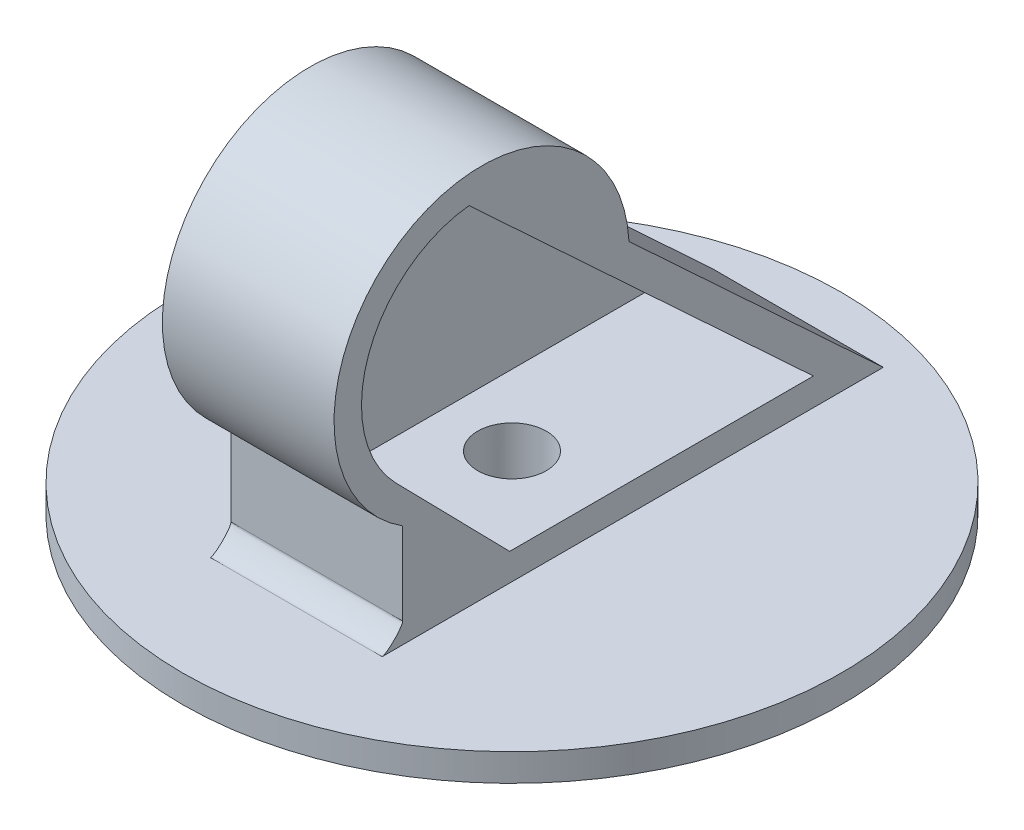
ISO-10303-21;
HEADER;
FILE_DESCRIPTION(('STEP AP214'),'2;1');
FILE_NAME('part.step','',(''),(''),'','','');
FILE_SCHEMA(('AUTOMOTIVE_DESIGN { 1 0 10303 214 1 1 1 1 }'));
ENDSEC;
DATA;
#1=APPLICATION_CONTEXT('core data for automotive mechanical design processes');
#2=APPLICATION_PROTOCOL_DEFINITION('international standard','automotive_design',2000,#1);
#3=PRODUCT_CONTEXT('',#1,'mechanical');
#4=PRODUCT('Part','Part','',(#3));
#5=PRODUCT_RELATED_PRODUCT_CATEGORY('part','',(#4));
#6=PRODUCT_DEFINITION_FORMATION('','',#4);
#7=PRODUCT_DEFINITION_CONTEXT('part definition',#1,'design');
#8=PRODUCT_DEFINITION('design','',#6,#7);
#9=PRODUCT_DEFINITION_SHAPE('','',#8);
#10=(LENGTH_UNIT() NAMED_UNIT(*) SI_UNIT(.MILLI.,.METRE.));
#11=(NAMED_UNIT(*) PLANE_ANGLE_UNIT() SI_UNIT($,.RADIAN.));
#12=(NAMED_UNIT(*) SI_UNIT($,.STERADIAN.) SOLID_ANGLE_UNIT());
#13=UNCERTAINTY_MEASURE_WITH_UNIT(LENGTH_MEASURE(1.E-05),#10,'distance_accuracy_value','');
#14=(GEOMETRIC_REPRESENTATION_CONTEXT(3) GLOBAL_UNCERTAINTY_ASSIGNED_CONTEXT((#13)) GLOBAL_UNIT_ASSIGNED_CONTEXT((#10,
#11,#12)) REPRESENTATION_CONTEXT('',''));
#15=CARTESIAN_POINT('',(0.,0.,0.));
#16=DIRECTION('',(0.,0.,1.));
#17=DIRECTION('',(1.,0.,0.));
#18=AXIS2_PLACEMENT_3D('',#15,#16,#17);
#19=CARTESIAN_POINT('',(43.5478533605228,4.,-109.406353042929));
#20=CARTESIAN_POINT('',(14.5159511201743,4.,-109.406353042929));
#21=CARTESIAN_POINT('',(-14.5159511201743,4.,-109.406353042929));
#22=CARTESIAN_POINT('',(-43.5478533605228,4.,-109.406353042929));
#23=CARTESIAN_POINT('',(43.5478533605228,4.,-112.406353042929));
#24=CARTESIAN_POINT('',(14.5159511201743,4.,-112.406353042929));
#25=CARTESIAN_POINT('',(-14.5159511201743,4.,-112.406353042929));
#26=CARTESIAN_POINT('',(-43.5478533605228,4.,-112.406353042929));
#27=CARTESIAN_POINT('',(43.5478533605228,7.,-112.406353042929));
#28=CARTESIAN_POINT('',(14.5159511201743,7.,-112.406353042929));
#29=CARTESIAN_POINT('',(-14.5159511201743,7.,-112.406353042929));
#30=CARTESIAN_POINT('',(-43.5478533605228,7.,-112.406353042929));
#31=(BOUNDED_SURFACE() B_SPLINE_SURFACE(2,3,((#19,#20,#21,#22),(#23,#24,#25,#26),(#27,#28,#29,
#30)),.UNSPECIFIED.,.F.,.F.,.F.) B_SPLINE_SURFACE_WITH_KNOTS((3,3),(4,4),(0.,1.),
(-0.0310478533605228,0.0560478533605228),
.UNSPECIFIED.) GEOMETRIC_REPRESENTATION_ITEM() RATIONAL_B_SPLINE_SURFACE(((1.,1.,1.,1.),
(0.212132034355964,0.212132034355964,0.212132034355964,0.212132034355964),(1.,1.,1.,1.))) REPRESENTATION_ITEM('') SURFACE());
#32=CARTESIAN_POINT('',(43.5478533605228,7.,-112.406353042929));
#33=CARTESIAN_POINT('',(14.5159511201743,7.,-112.406353042929));
#34=CARTESIAN_POINT('',(-14.5159511201743,7.,-112.406353042929));
#35=CARTESIAN_POINT('',(-43.5478533605228,7.,-112.406353042929));
#36=(BOUNDED_CURVE() B_SPLINE_CURVE(3,(#32,#33,#34,#35),.UNSPECIFIED.,.F.,
.F.) B_SPLINE_CURVE_WITH_KNOTS((4,4),(-0.0310478533605228,0.0560478533605228),
.UNSPECIFIED.) CURVE() GEOMETRIC_REPRESENTATION_ITEM() RATIONAL_B_SPLINE_CURVE((1.,1.,1.,1.)) REPRESENTATION_ITEM(''));
#37=CARTESIAN_POINT('',(-12.5,7.,-112.406353042929));
#38=VERTEX_POINT('',#37);
#39=CARTESIAN_POINT('',(12.5,7.,-112.406353042929));
#40=VERTEX_POINT('',#39);
#41=EDGE_CURVE('E214',#38,#40,#36,.F.);
#42=CARTESIAN_POINT('',(-12.5,7.,-112.406353042929));
#43=CARTESIAN_POINT('',(-12.5,4.,-112.406353042929));
#44=CARTESIAN_POINT('',(-12.5,4.,-109.406353042929));
#45=(BOUNDED_CURVE() B_SPLINE_CURVE(2,(#42,#43,#44),.UNSPECIFIED.,.F.,
.F.) B_SPLINE_CURVE_WITH_KNOTS((3,3),(0.,1.),
.UNSPECIFIED.) CURVE() GEOMETRIC_REPRESENTATION_ITEM() RATIONAL_B_SPLINE_CURVE((1.,
0.212132034355964,1.)) REPRESENTATION_ITEM(''));
#46=CARTESIAN_POINT('',(-12.5,4.,-109.406353042929));
#47=VERTEX_POINT('',#46);
#48=EDGE_CURVE('E75',#38,#47,#45,.T.);
#49=CARTESIAN_POINT('',(-43.5478533605228,4.,-109.406353042929));
#50=CARTESIAN_POINT('',(-14.5159511201743,4.,-109.406353042929));
#51=CARTESIAN_POINT('',(14.5159511201743,4.,-109.406353042929));
#52=CARTESIAN_POINT('',(43.5478533605228,4.,-109.406353042929));
#53=(BOUNDED_CURVE() B_SPLINE_CURVE(3,(#49,#50,#51,#52),.UNSPECIFIED.,.F.,
.F.) B_SPLINE_CURVE_WITH_KNOTS((4,4),(-0.0310478533605228,0.0560478533605228),
.UNSPECIFIED.) CURVE() GEOMETRIC_REPRESENTATION_ITEM() RATIONAL_B_SPLINE_CURVE((1.,1.,1.,1.)) REPRESENTATION_ITEM(''));
#54=CARTESIAN_POINT('',(12.5,4.,-109.406353042929));
#55=VERTEX_POINT('',#54);
#56=EDGE_CURVE('E327',#55,#47,#53,.F.);
#57=CARTESIAN_POINT('',(12.5,4.,-109.406353042929));
#58=CARTESIAN_POINT('',(12.5,4.,-112.406353042929));
#59=CARTESIAN_POINT('',(12.5,7.,-112.406353042929));
#60=(BOUNDED_CURVE() B_SPLINE_CURVE(2,(#57,#58,#59),.UNSPECIFIED.,.F.,
.F.) B_SPLINE_CURVE_WITH_KNOTS((3,3),(0.,1.),
.UNSPECIFIED.) CURVE() GEOMETRIC_REPRESENTATION_ITEM() RATIONAL_B_SPLINE_CURVE((1.,
0.212132034355964,1.)) REPRESENTATION_ITEM(''));
#61=EDGE_CURVE('E13',#55,#40,#60,.T.);
#62=ORIENTED_EDGE('',*,*,#41,.F.);
#63=ORIENTED_EDGE('',*,*,#48,.T.);
#64=ORIENTED_EDGE('',*,*,#56,.F.);
#65=ORIENTED_EDGE('',*,*,#61,.T.);
#66=EDGE_LOOP('',(#62,#63,#64,#65));
#67=FACE_BOUND('',#66,.T.);
#68=ADVANCED_FACE('F62',(#67),#31,.T.);
#69=CARTESIAN_POINT('',(0.,0.,-99.5736216897968));
#70=DIRECTION('',(0.,-1.,0.));
#71=DIRECTION('',(0.,0.,-1.));
#72=AXIS2_PLACEMENT_3D('',#69,#70,#71);
#73=DEGENERATE_TOROIDAL_SURFACE('',#72,0.650000000000002,1.1,.T.);
#74=CARTESIAN_POINT('',(0.,1.1,-99.5736216897968));
#75=DIRECTION('',(0.,-1.,0.));
#76=DIRECTION('',(0.,0.,-1.));
#77=AXIS2_PLACEMENT_3D('',#74,#75,#76);
#78=CIRCLE('',#77,0.650000000000002);
#79=CARTESIAN_POINT('',(0.,1.1,-100.223621689797));
#80=VERTEX_POINT('',#79);
#81=EDGE_CURVE('E466',#80,#80,#78,.T.);
#82=ORIENTED_EDGE('',*,*,#81,.F.);
#83=EDGE_LOOP('',(#82));
#84=FACE_BOUND('',#83,.T.);
#85=CARTESIAN_POINT('',(0.,0.,-99.5736216897968));
#86=DIRECTION('',(0.,-1.,0.));
#87=DIRECTION('',(0.,0.,-1.));
#88=AXIS2_PLACEMENT_3D('',#85,#86,#87);
#89=CIRCLE('',#88,1.75);
#90=CARTESIAN_POINT('',(0.,0.,-101.323621689797));
#91=VERTEX_POINT('',#90);
#92=EDGE_CURVE('E457',#91,#91,#89,.T.);
#93=ORIENTED_EDGE('',*,*,#92,.T.);
#94=EDGE_LOOP('',(#93));
#95=FACE_BOUND('',#94,.T.);
#96=ADVANCED_FACE('F480',(#84,#95),#73,.F.);
#97=CARTESIAN_POINT('',(0.,4.,-140.823621689797));
#98=DIRECTION('',(0.,-1.,0.));
#99=DIRECTION('',(0.,0.,-1.));
#100=AXIS2_PLACEMENT_3D('',#97,#98,#99);
#101=CYLINDRICAL_SURFACE('',#100,48.);
#102=CARTESIAN_POINT('',(0.,4.,-140.823621689797));
#103=DIRECTION('',(0.,1.,0.));
#104=DIRECTION('',(0.,0.,1.));
#105=AXIS2_PLACEMENT_3D('',#102,#103,#104);
#106=CIRCLE('',#105,48.);
#107=CARTESIAN_POINT('',(0.,4.,-92.8236216897968));
#108=VERTEX_POINT('',#107);
#109=EDGE_CURVE('E462',#108,#108,#106,.T.);
#110=ORIENTED_EDGE('',*,*,#109,.F.);
#111=EDGE_LOOP('',(#110));
#112=FACE_BOUND('',#111,.T.);
#113=CARTESIAN_POINT('',(0.,0.,-140.823621689797));
#114=DIRECTION('',(0.,1.,0.));
#115=DIRECTION('',(0.,0.,1.));
#116=AXIS2_PLACEMENT_3D('',#113,#114,#115);
#117=CIRCLE('',#116,48.);
#118=CARTESIAN_POINT('',(0.,0.,-92.8236216897968));
#119=VERTEX_POINT('',#118);
#120=EDGE_CURVE('E461',#119,#119,#117,.T.);
#121=ORIENTED_EDGE('',*,*,#120,.T.);
#122=EDGE_LOOP('',(#121));
#123=FACE_BOUND('',#122,.T.);
#124=ADVANCED_FACE('F304',(#112,#123),#101,.T.);
#125=CARTESIAN_POINT('',(0.,4.,-140.823621689797));
#126=DIRECTION('',(0.,1.,0.));
#127=DIRECTION('',(0.,0.,1.));
#128=AXIS2_PLACEMENT_3D('',#125,#126,#127);
#129=PLANE('',#128);
#130=ORIENTED_EDGE('',*,*,#56,.T.);
#131=DIRECTION('',(0.,0.,1.));
#132=VECTOR('',#131,1.);
#133=CARTESIAN_POINT('',(-12.5,3.99999999999999,0.));
#134=LINE('',#133,#132);
#135=CARTESIAN_POINT('',(-12.5,4.,-182.406353042929));
#136=VERTEX_POINT('',#135);
#137=EDGE_CURVE('E90',#136,#47,#134,.T.);
#138=ORIENTED_EDGE('',*,*,#137,.F.);
#139=DIRECTION('',(-1.,0.,0.));
#140=VECTOR('',#139,1.);
#141=CARTESIAN_POINT('',(12.5,4.,-182.406353042929));
#142=LINE('',#141,#140);
#143=CARTESIAN_POINT('',(12.5,4.,-182.406353042929));
#144=VERTEX_POINT('',#143);
#145=EDGE_CURVE('E385',#144,#136,#142,.T.);
#146=ORIENTED_EDGE('',*,*,#145,.F.);
#147=DIRECTION('',(0.,0.,1.));
#148=VECTOR('',#147,1.);
#149=CARTESIAN_POINT('',(12.5,3.99999999999999,0.));
#150=LINE('',#149,#148);
#151=EDGE_CURVE('E205',#144,#55,#150,.T.);
#152=ORIENTED_EDGE('',*,*,#151,.T.);
#153=EDGE_LOOP('',(#130,#138,#146,#152));
#154=FACE_BOUND('',#153,.T.);
#155=ORIENTED_EDGE('',*,*,#109,.T.);
#156=EDGE_LOOP('',(#155));
#157=FACE_BOUND('',#156,.T.);
#158=ADVANCED_FACE('F300',(#154,#157),#129,.T.);
#159=CARTESIAN_POINT('',(0.,0.,-140.823621689797));
#160=DIRECTION('',(0.,1.,0.));
#161=DIRECTION('',(0.,0.,1.));
#162=AXIS2_PLACEMENT_3D('',#159,#160,#161);
#163=PLANE('',#162);
#164=CARTESIAN_POINT('',(0.,0.,-140.823621689797));
#165=DIRECTION('',(0.,1.,0.));
#166=DIRECTION('',(0.,0.,1.));
#167=AXIS2_PLACEMENT_3D('',#164,#165,#166);
#168=CIRCLE('',#167,5.);
#169=CARTESIAN_POINT('',(0.,0.,-135.823621689797));
#170=VERTEX_POINT('',#169);
#171=EDGE_CURVE('E168',#170,#170,#168,.T.);
#172=ORIENTED_EDGE('',*,*,#171,.T.);
#173=EDGE_LOOP('',(#172));
#174=FACE_BOUND('',#173,.T.);
#175=CARTESIAN_POINT('',(41.25,0.,-140.823621689797));
#176=DIRECTION('',(0.,-1.,0.));
#177=DIRECTION('',(-1.,0.,0.));
#178=AXIS2_PLACEMENT_3D('',#175,#176,#177);
#179=CIRCLE('',#178,1.75);
#180=CARTESIAN_POINT('',(39.5,0.,-140.823621689797));
#181=VERTEX_POINT('',#180);
#182=EDGE_CURVE('E418',#181,#181,#179,.T.);
#183=ORIENTED_EDGE('',*,*,#182,.F.);
#184=EDGE_LOOP('',(#183));
#185=FACE_BOUND('',#184,.T.);
#186=CARTESIAN_POINT('',(29.1681547239449,0.,-169.991776413742));
#187=DIRECTION('',(0.,-1.,0.));
#188=DIRECTION('',(-0.707106781186544,0.,0.707106781186551));
#189=AXIS2_PLACEMENT_3D('',#186,#187,#188);
#190=CIRCLE('',#189,1.75);
#191=CARTESIAN_POINT('',(27.9307178568685,0.,-168.754339546666));
#192=VERTEX_POINT('',#191);
#193=EDGE_CURVE('E428',#192,#192,#190,.T.);
#194=ORIENTED_EDGE('',*,*,#193,.F.);
#195=EDGE_LOOP('',(#194));
#196=FACE_BOUND('',#195,.T.);
#197=CARTESIAN_POINT('',(0.,0.,-182.073621689797));
#198=DIRECTION('',(0.,-1.,0.));
#199=DIRECTION('',(0.,0.,1.));
#200=AXIS2_PLACEMENT_3D('',#197,#198,#199);
#201=CIRCLE('',#200,1.75);
#202=CARTESIAN_POINT('',(0.,0.,-180.323621689797));
#203=VERTEX_POINT('',#202);
#204=EDGE_CURVE('E436',#203,#203,#201,.T.);
#205=ORIENTED_EDGE('',*,*,#204,.F.);
#206=EDGE_LOOP('',(#205));
#207=FACE_BOUND('',#206,.T.);
#208=CARTESIAN_POINT('',(-29.1681547239453,0.,-169.991776413742));
#209=DIRECTION('',(0.,-1.,0.));
#210=DIRECTION('',(0.707106781186554,0.,0.707106781186541));
#211=AXIS2_PLACEMENT_3D('',#208,#209,#210);
#212=CIRCLE('',#211,1.75);
#213=CARTESIAN_POINT('',(-27.9307178568689,0.,-168.754339546665));
#214=VERTEX_POINT('',#213);
#215=EDGE_CURVE('E411',#214,#214,#212,.T.);
#216=ORIENTED_EDGE('',*,*,#215,.F.);
#217=EDGE_LOOP('',(#216));
#218=FACE_BOUND('',#217,.T.);
#219=CARTESIAN_POINT('',(-41.25,0.,-140.823621689796));
#220=DIRECTION('',(0.,-1.,0.));
#221=DIRECTION('',(1.,0.,0.));
#222=AXIS2_PLACEMENT_3D('',#219,#220,#221);
#223=CIRCLE('',#222,1.75);
#224=CARTESIAN_POINT('',(-39.5,0.,-140.823621689796));
#225=VERTEX_POINT('',#224);
#226=EDGE_CURVE('E402',#225,#225,#223,.T.);
#227=ORIENTED_EDGE('',*,*,#226,.F.);
#228=EDGE_LOOP('',(#227));
#229=FACE_BOUND('',#228,.T.);
#230=CARTESIAN_POINT('',(-29.1681547239447,0.,-111.655466965851));
#231=DIRECTION('',(0.,-1.,0.));
#232=DIRECTION('',(0.707106781186539,0.,-0.707106781186556));
#233=AXIS2_PLACEMENT_3D('',#230,#231,#232);
#234=CIRCLE('',#233,1.75);
#235=CARTESIAN_POINT('',(-27.9307178568683,0.,-112.892903832928));
#236=VERTEX_POINT('',#235);
#237=EDGE_CURVE('E401',#236,#236,#234,.T.);
#238=ORIENTED_EDGE('',*,*,#237,.F.);
#239=EDGE_LOOP('',(#238));
#240=FACE_BOUND('',#239,.T.);
#241=CARTESIAN_POINT('',(29.1681547239451,0.,-111.655466965852));
#242=DIRECTION('',(0.,-1.,0.));
#243=DIRECTION('',(-0.707106781186549,0.,-0.707106781186546));
#244=AXIS2_PLACEMENT_3D('',#241,#242,#243);
#245=CIRCLE('',#244,1.75);
#246=CARTESIAN_POINT('',(27.9307178568687,0.,-112.892903832928));
#247=VERTEX_POINT('',#246);
#248=EDGE_CURVE('E427',#247,#247,#245,.T.);
#249=ORIENTED_EDGE('',*,*,#248,.F.);
#250=EDGE_LOOP('',(#249));
#251=FACE_BOUND('',#250,.T.);
#252=ORIENTED_EDGE('',*,*,#92,.F.);
#253=EDGE_LOOP('',(#252));
#254=FACE_BOUND('',#253,.T.);
#255=ORIENTED_EDGE('',*,*,#120,.F.);
#256=EDGE_LOOP('',(#255));
#257=FACE_BOUND('',#256,.T.);
#258=ADVANCED_FACE('F298',(#174,#185,#196,#207,#218,#229,#240,#251,#254,#257),#163,.F.);
#259=CARTESIAN_POINT('',(0.,1.1,0.));
#260=DIRECTION('',(0.,-1.,0.));
#261=DIRECTION('',(0.,0.,-1.));
#262=AXIS2_PLACEMENT_3D('',#259,#260,#261);
#263=PLANE('',#262);
#264=ORIENTED_EDGE('',*,*,#81,.T.);
#265=EDGE_LOOP('',(#264));
#266=FACE_BOUND('',#265,.T.);
#267=ADVANCED_FACE('F294',(#266),#263,.T.);
#268=CARTESIAN_POINT('',(99.5773378481045,1.1,-41.2462838416927));
#269=DIRECTION('',(0.,-1.,0.));
#270=DIRECTION('',(-0.707106781186549,0.,-0.707106781186546));
#271=AXIS2_PLACEMENT_3D('',#268,#269,#270);
#272=PLANE('',#271);
#273=CARTESIAN_POINT('',(29.1681547239451,1.1,-111.655466965852));
#274=DIRECTION('',(0.,-1.,0.));
#275=DIRECTION('',(-0.707106781186549,0.,-0.707106781186546));
#276=AXIS2_PLACEMENT_3D('',#273,#274,#275);
#277=CIRCLE('',#276,0.650000000000002);
#278=CARTESIAN_POINT('',(28.7085353161739,1.1,-112.115086373623));
#279=VERTEX_POINT('',#278);
#280=EDGE_CURVE('E453',#279,#279,#277,.T.);
#281=ORIENTED_EDGE('',*,*,#280,.T.);
#282=EDGE_LOOP('',(#281));
#283=FACE_BOUND('',#282,.T.);
#284=ADVANCED_FACE('F290',(#283),#272,.T.);
#285=CARTESIAN_POINT('',(29.1681547239451,0.,-111.655466965852));
#286=DIRECTION('',(0.,-1.,0.));
#287=DIRECTION('',(-0.707106781186549,0.,-0.707106781186546));
#288=AXIS2_PLACEMENT_3D('',#285,#286,#287);
#289=DEGENERATE_TOROIDAL_SURFACE('',#288,0.650000000000002,1.1,.T.);
#290=ORIENTED_EDGE('',*,*,#280,.F.);
#291=EDGE_LOOP('',(#290));
#292=FACE_BOUND('',#291,.T.);
#293=ORIENTED_EDGE('',*,*,#248,.T.);
#294=EDGE_LOOP('',(#293));
#295=FACE_BOUND('',#294,.T.);
#296=ADVANCED_FACE('F256',(#292,#295),#289,.F.);
#297=CARTESIAN_POINT('',(-99.5773378481031,1.1,-41.2462838416913));
#298=DIRECTION('',(0.,-1.,0.));
#299=DIRECTION('',(0.707106781186539,0.,-0.707106781186556));
#300=AXIS2_PLACEMENT_3D('',#297,#298,#299);
#301=PLANE('',#300);
#302=CARTESIAN_POINT('',(-29.1681547239447,1.1,-111.655466965851));
#303=DIRECTION('',(0.,-1.,0.));
#304=DIRECTION('',(0.707106781186539,0.,-0.707106781186556));
#305=AXIS2_PLACEMENT_3D('',#302,#303,#304);
#306=CIRCLE('',#305,0.650000000000002);
#307=CARTESIAN_POINT('',(-28.7085353161735,1.1,-112.115086373623));
#308=VERTEX_POINT('',#307);
#309=EDGE_CURVE('E407',#308,#308,#306,.T.);
#310=ORIENTED_EDGE('',*,*,#309,.T.);
#311=EDGE_LOOP('',(#310));
#312=FACE_BOUND('',#311,.T.);
#313=ADVANCED_FACE('F252',(#312),#301,.T.);
#314=CARTESIAN_POINT('',(-29.1681547239447,0.,-111.655466965851));
#315=DIRECTION('',(0.,-1.,0.));
#316=DIRECTION('',(0.707106781186539,0.,-0.707106781186556));
#317=AXIS2_PLACEMENT_3D('',#314,#315,#316);
#318=DEGENERATE_TOROIDAL_SURFACE('',#317,0.650000000000002,1.1,.T.);
#319=ORIENTED_EDGE('',*,*,#309,.F.);
#320=EDGE_LOOP('',(#319));
#321=FACE_BOUND('',#320,.T.);
#322=ORIENTED_EDGE('',*,*,#237,.T.);
#323=EDGE_LOOP('',(#322));
#324=FACE_BOUND('',#323,.T.);
#325=ADVANCED_FACE('F248',(#321,#324),#318,.F.);
#326=CARTESIAN_POINT('',(-140.823621689797,1.1,-140.823621689795));
#327=DIRECTION('',(0.,-1.,0.));
#328=DIRECTION('',(1.,0.,0.));
#329=AXIS2_PLACEMENT_3D('',#326,#327,#328);
#330=PLANE('',#329);
#331=CARTESIAN_POINT('',(-41.25,1.1,-140.823621689796));
#332=DIRECTION('',(0.,-1.,0.));
#333=DIRECTION('',(1.,0.,0.));
#334=AXIS2_PLACEMENT_3D('',#331,#332,#333);
#335=CIRCLE('',#334,0.650000000000002);
#336=CARTESIAN_POINT('',(-40.6,1.1,-140.823621689796));
#337=VERTEX_POINT('',#336);
#338=EDGE_CURVE('E406',#337,#337,#335,.T.);
#339=ORIENTED_EDGE('',*,*,#338,.T.);
#340=EDGE_LOOP('',(#339));
#341=FACE_BOUND('',#340,.T.);
#342=ADVANCED_FACE('F244',(#341),#330,.T.);
#343=CARTESIAN_POINT('',(-41.25,0.,-140.823621689796));
#344=DIRECTION('',(0.,-1.,0.));
#345=DIRECTION('',(1.,0.,0.));
#346=AXIS2_PLACEMENT_3D('',#343,#344,#345);
#347=DEGENERATE_TOROIDAL_SURFACE('',#346,0.650000000000002,1.1,.T.);
#348=ORIENTED_EDGE('',*,*,#338,.F.);
#349=EDGE_LOOP('',(#348));
#350=FACE_BOUND('',#349,.T.);
#351=ORIENTED_EDGE('',*,*,#226,.T.);
#352=EDGE_LOOP('',(#351));
#353=FACE_BOUND('',#352,.T.);
#354=ADVANCED_FACE('F240',(#350,#353),#347,.F.);
#355=CARTESIAN_POINT('',(-99.5773378481051,1.1,-240.4009595379));
#356=DIRECTION('',(0.,-1.,0.));
#357=DIRECTION('',(0.707106781186554,0.,0.707106781186541));
#358=AXIS2_PLACEMENT_3D('',#355,#356,#357);
#359=PLANE('',#358);
#360=CARTESIAN_POINT('',(-29.1681547239453,1.1,-169.991776413742));
#361=DIRECTION('',(0.,-1.,0.));
#362=DIRECTION('',(0.707106781186554,0.,0.707106781186541));
#363=AXIS2_PLACEMENT_3D('',#360,#361,#362);
#364=CIRCLE('',#363,0.650000000000002);
#365=CARTESIAN_POINT('',(-28.7085353161741,1.1,-169.53215700597));
#366=VERTEX_POINT('',#365);
#367=EDGE_CURVE('E440',#366,#366,#364,.T.);
#368=ORIENTED_EDGE('',*,*,#367,.T.);
#369=EDGE_LOOP('',(#368));
#370=FACE_BOUND('',#369,.T.);
#371=ADVANCED_FACE('F243',(#370),#359,.T.);
#372=CARTESIAN_POINT('',(-29.1681547239453,0.,-169.991776413742));
#373=DIRECTION('',(0.,-1.,0.));
#374=DIRECTION('',(0.707106781186554,0.,0.707106781186541));
#375=AXIS2_PLACEMENT_3D('',#372,#373,#374);
#376=DEGENERATE_TOROIDAL_SURFACE('',#375,0.650000000000002,1.1,.T.);
#377=ORIENTED_EDGE('',*,*,#367,.F.);
#378=EDGE_LOOP('',(#377));
#379=FACE_BOUND('',#378,.T.);
#380=ORIENTED_EDGE('',*,*,#215,.T.);
#381=EDGE_LOOP('',(#380));
#382=FACE_BOUND('',#381,.T.);
#383=ADVANCED_FACE('F280',(#379,#382),#376,.F.);
#384=CARTESIAN_POINT('',(0.,1.1,-281.647243379594));
#385=DIRECTION('',(0.,-1.,0.));
#386=DIRECTION('',(0.,0.,1.));
#387=AXIS2_PLACEMENT_3D('',#384,#385,#386);
#388=PLANE('',#387);
#389=CARTESIAN_POINT('',(0.,1.1,-182.073621689797));
#390=DIRECTION('',(0.,-1.,0.));
#391=DIRECTION('',(0.,0.,1.));
#392=AXIS2_PLACEMENT_3D('',#389,#390,#391);
#393=CIRCLE('',#392,0.650000000000002);
#394=CARTESIAN_POINT('',(0.,1.1,-181.423621689797));
#395=VERTEX_POINT('',#394);
#396=EDGE_CURVE('E432',#395,#395,#393,.T.);
#397=ORIENTED_EDGE('',*,*,#396,.T.);
#398=EDGE_LOOP('',(#397));
#399=FACE_BOUND('',#398,.T.);
#400=ADVANCED_FACE('F276',(#399),#388,.T.);
#401=CARTESIAN_POINT('',(0.,0.,-182.073621689797));
#402=DIRECTION('',(0.,-1.,0.));
#403=DIRECTION('',(0.,0.,1.));
#404=AXIS2_PLACEMENT_3D('',#401,#402,#403);
#405=DEGENERATE_TOROIDAL_SURFACE('',#404,0.650000000000002,1.1,.T.);
#406=ORIENTED_EDGE('',*,*,#396,.F.);
#407=EDGE_LOOP('',(#406));
#408=FACE_BOUND('',#407,.T.);
#409=ORIENTED_EDGE('',*,*,#204,.T.);
#410=EDGE_LOOP('',(#409));
#411=FACE_BOUND('',#410,.T.);
#412=ADVANCED_FACE('F272',(#408,#411),#405,.F.);
#413=CARTESIAN_POINT('',(99.5773378481038,1.1,-240.400959537902));
#414=DIRECTION('',(0.,-1.,0.));
#415=DIRECTION('',(-0.707106781186544,0.,0.707106781186551));
#416=AXIS2_PLACEMENT_3D('',#413,#414,#415);
#417=PLANE('',#416);
#418=CARTESIAN_POINT('',(29.1681547239449,1.1,-169.991776413742));
#419=DIRECTION('',(0.,-1.,0.));
#420=DIRECTION('',(-0.707106781186544,0.,0.707106781186551));
#421=AXIS2_PLACEMENT_3D('',#418,#419,#420);
#422=CIRCLE('',#421,0.650000000000002);
#423=CARTESIAN_POINT('',(28.7085353161737,1.1,-169.532157005971));
#424=VERTEX_POINT('',#423);
#425=EDGE_CURVE('E423',#424,#424,#422,.T.);
#426=ORIENTED_EDGE('',*,*,#425,.T.);
#427=EDGE_LOOP('',(#426));
#428=FACE_BOUND('',#427,.T.);
#429=ADVANCED_FACE('F268',(#428),#417,.T.);
#430=CARTESIAN_POINT('',(29.1681547239449,0.,-169.991776413742));
#431=DIRECTION('',(0.,-1.,0.));
#432=DIRECTION('',(-0.707106781186544,0.,0.707106781186551));
#433=AXIS2_PLACEMENT_3D('',#430,#431,#432);
#434=DEGENERATE_TOROIDAL_SURFACE('',#433,0.650000000000002,1.1,.T.);
#435=ORIENTED_EDGE('',*,*,#425,.F.);
#436=EDGE_LOOP('',(#435));
#437=FACE_BOUND('',#436,.T.);
#438=ORIENTED_EDGE('',*,*,#193,.T.);
#439=EDGE_LOOP('',(#438));
#440=FACE_BOUND('',#439,.T.);
#441=ADVANCED_FACE('F264',(#437,#440),#434,.F.);
#442=CARTESIAN_POINT('',(140.823621689797,1.1,-140.823621689797));
#443=DIRECTION('',(0.,-1.,0.));
#444=DIRECTION('',(-1.,0.,0.));
#445=AXIS2_PLACEMENT_3D('',#442,#443,#444);
#446=PLANE('',#445);
#447=CARTESIAN_POINT('',(41.25,1.1,-140.823621689797));
#448=DIRECTION('',(0.,-1.,0.));
#449=DIRECTION('',(-1.,0.,0.));
#450=AXIS2_PLACEMENT_3D('',#447,#448,#449);
#451=CIRCLE('',#450,0.650000000000002);
#452=CARTESIAN_POINT('',(40.6,1.1,-140.823621689797));
#453=VERTEX_POINT('',#452);
#454=EDGE_CURVE('E422',#453,#453,#451,.T.);
#455=ORIENTED_EDGE('',*,*,#454,.T.);
#456=EDGE_LOOP('',(#455));
#457=FACE_BOUND('',#456,.T.);
#458=ADVANCED_FACE('F260',(#457),#446,.T.);
#459=CARTESIAN_POINT('',(41.25,0.,-140.823621689797));
#460=DIRECTION('',(0.,-1.,0.));
#461=DIRECTION('',(-1.,0.,0.));
#462=AXIS2_PLACEMENT_3D('',#459,#460,#461);
#463=DEGENERATE_TOROIDAL_SURFACE('',#462,0.650000000000002,1.1,.T.);
#464=ORIENTED_EDGE('',*,*,#454,.F.);
#465=EDGE_LOOP('',(#464));
#466=FACE_BOUND('',#465,.T.);
#467=ORIENTED_EDGE('',*,*,#182,.T.);
#468=EDGE_LOOP('',(#467));
#469=FACE_BOUND('',#468,.T.);
#470=ADVANCED_FACE('F234',(#466,#469),#463,.F.);
#471=CARTESIAN_POINT('',(12.5,37.169010455161,-123.901441519329));
#472=DIRECTION('',(-1.,0.,0.));
#473=DIRECTION('',(0.,0.,1.));
#474=AXIS2_PLACEMENT_3D('',#471,#472,#473);
#475=CYLINDRICAL_SURFACE('',#474,21.4999999999999);
#476=CARTESIAN_POINT('',(-12.5,37.169010455161,-123.901441519329));
#477=DIRECTION('',(1.,0.,0.));
#478=DIRECTION('',(0.,0.,-1.));
#479=AXIS2_PLACEMENT_3D('',#476,#477,#478);
#480=CIRCLE('',#479,21.4999999999999);
#481=CARTESIAN_POINT('',(-12.5,38.3912194590592,-145.366673993047));
#482=VERTEX_POINT('',#481);
#483=CARTESIAN_POINT('',(-12.5,19.,-112.406353042929));
#484=VERTEX_POINT('',#483);
#485=EDGE_CURVE('E185',#482,#484,#480,.T.);
#486=ORIENTED_EDGE('',*,*,#485,.T.);
#487=DIRECTION('',(-1.,0.,0.));
#488=VECTOR('',#487,1.);
#489=CARTESIAN_POINT('',(12.5,19.,-112.406353042929));
#490=LINE('',#489,#488);
#491=CARTESIAN_POINT('',(12.5,19.,-112.406353042929));
#492=VERTEX_POINT('',#491);
#493=EDGE_CURVE('E388',#492,#484,#490,.T.);
#494=ORIENTED_EDGE('',*,*,#493,.F.);
#495=CARTESIAN_POINT('',(12.5,37.169010455161,-123.901441519329));
#496=DIRECTION('',(1.,0.,0.));
#497=DIRECTION('',(0.,0.,-1.));
#498=AXIS2_PLACEMENT_3D('',#495,#496,#497);
#499=CIRCLE('',#498,21.4999999999999);
#500=CARTESIAN_POINT('',(12.5,38.3912194590592,-145.366673993047));
#501=VERTEX_POINT('',#500);
#502=EDGE_CURVE('E191',#501,#492,#499,.T.);
#503=ORIENTED_EDGE('',*,*,#502,.F.);
#504=DIRECTION('',(-1.,0.,0.));
#505=VECTOR('',#504,1.);
#506=CARTESIAN_POINT('',(12.5,38.3912194590592,-145.366673993047));
#507=LINE('',#506,#505);
#508=EDGE_CURVE('E394',#501,#482,#507,.T.);
#509=ORIENTED_EDGE('',*,*,#508,.T.);
#510=EDGE_LOOP('',(#486,#494,#503,#509));
#511=FACE_BOUND('',#510,.T.);
#512=ADVANCED_FACE('F233',(#511),#475,.T.);
#513=CARTESIAN_POINT('',(12.5,0.,-112.406353042929));
#514=DIRECTION('',(0.,0.,1.));
#515=DIRECTION('',(1.,0.,0.));
#516=AXIS2_PLACEMENT_3D('',#513,#514,#515);
#517=PLANE('',#516);
#518=DIRECTION('',(0.,1.,0.));
#519=VECTOR('',#518,1.);
#520=CARTESIAN_POINT('',(-12.5,0.,-112.406353042929));
#521=LINE('',#520,#519);
#522=EDGE_CURVE('E206',#38,#484,#521,.T.);
#523=ORIENTED_EDGE('',*,*,#522,.F.);
#524=ORIENTED_EDGE('',*,*,#41,.T.);
#525=DIRECTION('',(0.,1.,0.));
#526=VECTOR('',#525,1.);
#527=CARTESIAN_POINT('',(12.5,0.,-112.406353042929));
#528=LINE('',#527,#526);
#529=EDGE_CURVE('E195',#40,#492,#528,.T.);
#530=ORIENTED_EDGE('',*,*,#529,.T.);
#531=ORIENTED_EDGE('',*,*,#493,.T.);
#532=EDGE_LOOP('',(#523,#524,#530,#531));
#533=FACE_BOUND('',#532,.T.);
#534=ADVANCED_FACE('F222',(#533),#517,.T.);
#535=CARTESIAN_POINT('',(12.5,93.1008682804744,-86.4438481918474));
#536=DIRECTION('',(0.,-0.73282080038124,0.680421688755288));
#537=DIRECTION('',(0.,-0.680421688755288,-0.73282080038124));
#538=AXIS2_PLACEMENT_3D('',#535,#536,#537);
#539=PLANE('',#538);
#540=ORIENTED_EDGE('',*,*,#508,.F.);
#541=DIRECTION('',(0.,0.680421688755288,0.73282080038124));
#542=VECTOR('',#541,1.);
#543=CARTESIAN_POINT('',(12.5,93.1008682804744,-86.4438481918474));
#544=LINE('',#543,#542);
#545=EDGE_CURVE('E199',#144,#501,#544,.T.);
#546=ORIENTED_EDGE('',*,*,#545,.F.);
#547=ORIENTED_EDGE('',*,*,#145,.T.);
#548=DIRECTION('',(0.,0.680421688755288,0.73282080038124));
#549=VECTOR('',#548,1.);
#550=CARTESIAN_POINT('',(-12.5,93.1008682804744,-86.4438481918474));
#551=LINE('',#550,#549);
#552=EDGE_CURVE('E196',#136,#482,#551,.T.);
#553=ORIENTED_EDGE('',*,*,#552,.T.);
#554=EDGE_LOOP('',(#540,#546,#547,#553));
#555=FACE_BOUND('',#554,.T.);
#556=ADVANCED_FACE('F232',(#555),#539,.F.);
#557=CARTESIAN_POINT('',(-12.5,0.,0.));
#558=DIRECTION('',(1.,0.,0.));
#559=DIRECTION('',(0.,0.,-1.));
#560=AXIS2_PLACEMENT_3D('',#557,#558,#559);
#561=PLANE('',#560);
#562=ORIENTED_EDGE('',*,*,#137,.T.);
#563=ORIENTED_EDGE('',*,*,#48,.F.);
#564=ORIENTED_EDGE('',*,*,#522,.T.);
#565=ORIENTED_EDGE('',*,*,#485,.F.);
#566=ORIENTED_EDGE('',*,*,#552,.F.);
#567=EDGE_LOOP('',(#562,#563,#564,#565,#566));
#568=FACE_BOUND('',#567,.T.);
#569=ADVANCED_FACE('F350',(#568),#561,.F.);
#570=CARTESIAN_POINT('',(12.5,0.,0.));
#571=DIRECTION('',(1.,0.,0.));
#572=DIRECTION('',(0.,0.,-1.));
#573=AXIS2_PLACEMENT_3D('',#570,#571,#572);
#574=PLANE('',#573);
#575=CARTESIAN_POINT('',(12.5,37.169010455161,-123.901441519329));
#576=DIRECTION('',(1.,0.,0.));
#577=DIRECTION('',(0.,0.,-1.));
#578=AXIS2_PLACEMENT_3D('',#575,#576,#577);
#579=CIRCLE('',#578,17.4999999999999);
#580=CARTESIAN_POINT('',(12.5,54.5719774972512,-122.061132270337));
#581=VERTEX_POINT('',#580);
#582=CARTESIAN_POINT('',(12.5,24.9194933239886,-111.403468481547));
#583=VERTEX_POINT('',#582);
#584=EDGE_CURVE('E82',#581,#583,#579,.T.);
#585=ORIENTED_EDGE('',*,*,#584,.F.);
#586=DIRECTION('',(0.,0.680421688755289,0.732820800381239));
#587=VECTOR('',#586,1.);
#588=CARTESIAN_POINT('',(12.5,90.1695850789494,-83.7221614368265));
#589=LINE('',#588,#587);
#590=CARTESIAN_POINT('',(12.5,8.,-172.219606623654));
#591=VERTEX_POINT('',#590);
#592=EDGE_CURVE('E161',#591,#581,#589,.T.);
#593=ORIENTED_EDGE('',*,*,#592,.F.);
#594=DIRECTION('',(0.,0.,-1.));
#595=VECTOR('',#594,1.);
#596=CARTESIAN_POINT('',(12.5,8.,0.));
#597=LINE('',#596,#595);
#598=CARTESIAN_POINT('',(12.5,7.99999999999999,-127.986607419071));
#599=VERTEX_POINT('',#598);
#600=EDGE_CURVE('E165',#599,#591,#597,.T.);
#601=ORIENTED_EDGE('',*,*,#600,.F.);
#602=DIRECTION('',(0.,-0.714169887873225,-0.699972407495571));
#603=VECTOR('',#602,1.);
#604=CARTESIAN_POINT('',(12.5,67.9000956485968,-69.2773074719327));
#605=LINE('',#604,#603);
#606=EDGE_CURVE('E176',#583,#599,#605,.T.);
#607=ORIENTED_EDGE('',*,*,#606,.F.);
#608=EDGE_LOOP('',(#585,#593,#601,#607));
#609=FACE_BOUND('',#608,.T.);
#610=ORIENTED_EDGE('',*,*,#545,.T.);
#611=ORIENTED_EDGE('',*,*,#502,.T.);
#612=ORIENTED_EDGE('',*,*,#529,.F.);
#613=ORIENTED_EDGE('',*,*,#61,.F.);
#614=ORIENTED_EDGE('',*,*,#151,.F.);
#615=EDGE_LOOP('',(#610,#611,#612,#613,#614));
#616=FACE_BOUND('',#615,.T.);
#617=ADVANCED_FACE('F239',(#609,#616),#574,.T.);
#618=CARTESIAN_POINT('',(-10.3,37.169010455161,-123.901441519329));
#619=DIRECTION('',(1.,0.,0.));
#620=DIRECTION('',(0.,0.,-1.));
#621=AXIS2_PLACEMENT_3D('',#618,#619,#620);
#622=CYLINDRICAL_SURFACE('',#621,17.4999999999999);
#623=ORIENTED_EDGE('',*,*,#584,.T.);
#624=DIRECTION('',(1.,0.,0.));
#625=VECTOR('',#624,1.);
#626=CARTESIAN_POINT('',(-10.3,24.9194933239886,-111.403468481547));
#627=LINE('',#626,#625);
#628=CARTESIAN_POINT('',(-10.3,24.9194933239886,-111.403468481547));
#629=VERTEX_POINT('',#628);
#630=EDGE_CURVE('E136',#629,#583,#627,.T.);
#631=ORIENTED_EDGE('',*,*,#630,.F.);
#632=CARTESIAN_POINT('',(-10.3,37.169010455161,-123.901441519329));
#633=DIRECTION('',(1.,0.,0.));
#634=DIRECTION('',(0.,0.,-1.));
#635=AXIS2_PLACEMENT_3D('',#632,#633,#634);
#636=CIRCLE('',#635,17.4999999999999);
#637=CARTESIAN_POINT('',(-10.3,54.5719774972512,-122.061132270337));
#638=VERTEX_POINT('',#637);
#639=EDGE_CURVE('E140',#638,#629,#636,.T.);
#640=ORIENTED_EDGE('',*,*,#639,.F.);
#641=DIRECTION('',(1.,0.,0.));
#642=VECTOR('',#641,1.);
#643=CARTESIAN_POINT('',(-10.3,54.5719774972512,-122.061132270337));
#644=LINE('',#643,#642);
#645=EDGE_CURVE('E182',#638,#581,#644,.T.);
#646=ORIENTED_EDGE('',*,*,#645,.T.);
#647=EDGE_LOOP('',(#623,#631,#640,#646));
#648=FACE_BOUND('',#647,.T.);
#649=ADVANCED_FACE('F138',(#648),#622,.F.);
#650=CARTESIAN_POINT('',(-10.3,90.1695850789494,-83.7221614368265));
#651=DIRECTION('',(0.,0.732820800381239,-0.680421688755289));
#652=DIRECTION('',(0.,0.680421688755289,0.732820800381239));
#653=AXIS2_PLACEMENT_3D('',#650,#651,#652);
#654=PLANE('',#653);
#655=ORIENTED_EDGE('',*,*,#592,.T.);
#656=ORIENTED_EDGE('',*,*,#645,.F.);
#657=DIRECTION('',(0.,0.680421688755289,0.732820800381239));
#658=VECTOR('',#657,1.);
#659=CARTESIAN_POINT('',(-10.3,90.1695850789494,-83.7221614368265));
#660=LINE('',#659,#658);
#661=CARTESIAN_POINT('',(-10.3,8.,-172.219606623654));
#662=VERTEX_POINT('',#661);
#663=EDGE_CURVE('E147',#662,#638,#660,.T.);
#664=ORIENTED_EDGE('',*,*,#663,.F.);
#665=DIRECTION('',(1.,0.,0.));
#666=VECTOR('',#665,1.);
#667=CARTESIAN_POINT('',(-10.3,8.,-172.219606623654));
#668=LINE('',#667,#666);
#669=EDGE_CURVE('E186',#662,#591,#668,.T.);
#670=ORIENTED_EDGE('',*,*,#669,.T.);
#671=EDGE_LOOP('',(#655,#656,#664,#670));
#672=FACE_BOUND('',#671,.T.);
#673=ADVANCED_FACE('F600',(#672),#654,.F.);
#674=CARTESIAN_POINT('',(-10.3,8.,0.));
#675=DIRECTION('',(0.,-1.,0.));
#676=DIRECTION('',(0.,0.,-1.));
#677=AXIS2_PLACEMENT_3D('',#674,#675,#676);
#678=PLANE('',#677);
#679=CARTESIAN_POINT('',(0.,8.,-140.823621689797));
#680=DIRECTION('',(0.,-1.,0.));
#681=DIRECTION('',(0.,0.,-1.));
#682=AXIS2_PLACEMENT_3D('',#679,#680,#681);
#683=CIRCLE('',#682,5.);
#684=CARTESIAN_POINT('',(0.,8.,-145.823621689797));
#685=VERTEX_POINT('',#684);
#686=EDGE_CURVE('E69',#685,#685,#683,.F.);
#687=ORIENTED_EDGE('',*,*,#686,.F.);
#688=EDGE_LOOP('',(#687));
#689=FACE_BOUND('',#688,.T.);
#690=ORIENTED_EDGE('',*,*,#600,.T.);
#691=ORIENTED_EDGE('',*,*,#669,.F.);
#692=DIRECTION('',(0.,0.,-1.));
#693=VECTOR('',#692,1.);
#694=CARTESIAN_POINT('',(-10.3,8.,0.));
#695=LINE('',#694,#693);
#696=CARTESIAN_POINT('',(-10.3,7.99999999999999,-127.986607419071));
#697=VERTEX_POINT('',#696);
#698=EDGE_CURVE('E156',#697,#662,#695,.T.);
#699=ORIENTED_EDGE('',*,*,#698,.F.);
#700=DIRECTION('',(1.,0.,0.));
#701=VECTOR('',#700,1.);
#702=CARTESIAN_POINT('',(-10.3,7.99999999999999,-127.986607419071));
#703=LINE('',#702,#701);
#704=EDGE_CURVE('E146',#697,#599,#703,.T.);
#705=ORIENTED_EDGE('',*,*,#704,.T.);
#706=EDGE_LOOP('',(#690,#691,#699,#705));
#707=FACE_BOUND('',#706,.T.);
#708=ADVANCED_FACE('F606',(#689,#707),#678,.F.);
#709=CARTESIAN_POINT('',(-10.3,67.9000956485968,-69.2773074719327));
#710=DIRECTION('',(0.,-0.699972407495571,0.714169887873225));
#711=DIRECTION('',(0.,-0.714169887873225,-0.699972407495571));
#712=AXIS2_PLACEMENT_3D('',#709,#710,#711);
#713=PLANE('',#712);
#714=ORIENTED_EDGE('',*,*,#606,.T.);
#715=ORIENTED_EDGE('',*,*,#704,.F.);
#716=DIRECTION('',(0.,-0.714169887873225,-0.699972407495571));
#717=VECTOR('',#716,1.);
#718=CARTESIAN_POINT('',(-10.3,67.9000956485968,-69.2773074719327));
#719=LINE('',#718,#717);
#720=EDGE_CURVE('E150',#629,#697,#719,.T.);
#721=ORIENTED_EDGE('',*,*,#720,.F.);
#722=ORIENTED_EDGE('',*,*,#630,.T.);
#723=EDGE_LOOP('',(#714,#715,#721,#722));
#724=FACE_BOUND('',#723,.T.);
#725=ADVANCED_FACE('F151',(#724),#713,.F.);
#726=CARTESIAN_POINT('',(-10.3,0.,0.));
#727=DIRECTION('',(1.,0.,0.));
#728=DIRECTION('',(0.,0.,-1.));
#729=AXIS2_PLACEMENT_3D('',#726,#727,#728);
#730=PLANE('',#729);
#731=ORIENTED_EDGE('',*,*,#639,.T.);
#732=ORIENTED_EDGE('',*,*,#720,.T.);
#733=ORIENTED_EDGE('',*,*,#698,.T.);
#734=ORIENTED_EDGE('',*,*,#663,.T.);
#735=EDGE_LOOP('',(#731,#732,#733,#734));
#736=FACE_BOUND('',#735,.T.);
#737=ADVANCED_FACE('F158',(#736),#730,.T.);
#738=CARTESIAN_POINT('',(0.,14.8,-140.823621689797));
#739=DIRECTION('',(0.,-1.,0.));
#740=DIRECTION('',(0.,0.,-1.));
#741=AXIS2_PLACEMENT_3D('',#738,#739,#740);
#742=CYLINDRICAL_SURFACE('',#741,5.);
#743=ORIENTED_EDGE('',*,*,#171,.F.);
#744=EDGE_LOOP('',(#743));
#745=FACE_BOUND('',#744,.T.);
#746=ORIENTED_EDGE('',*,*,#686,.T.);
#747=EDGE_LOOP('',(#746));
#748=FACE_BOUND('',#747,.T.);
#749=ADVANCED_FACE('F627',(#745,#748),#742,.F.);
#750=CLOSED_SHELL('',(#68,#96,#124,#158,#258,#267,#284,#296,#313,#325,#342,#354,#371,#383,#400,
#412,#429,#441,#458,#470,#512,#534,#556,#569,#617,#649,#673,#708,#725,#737,#749));
#751=MANIFOLD_SOLID_BREP('B2',#750);
#752=ADVANCED_BREP_SHAPE_REPRESENTATION('',(#18,#751),#14);
#753=SHAPE_DEFINITION_REPRESENTATION(#9,#752);
ENDSEC;
END-ISO-10303-21;
